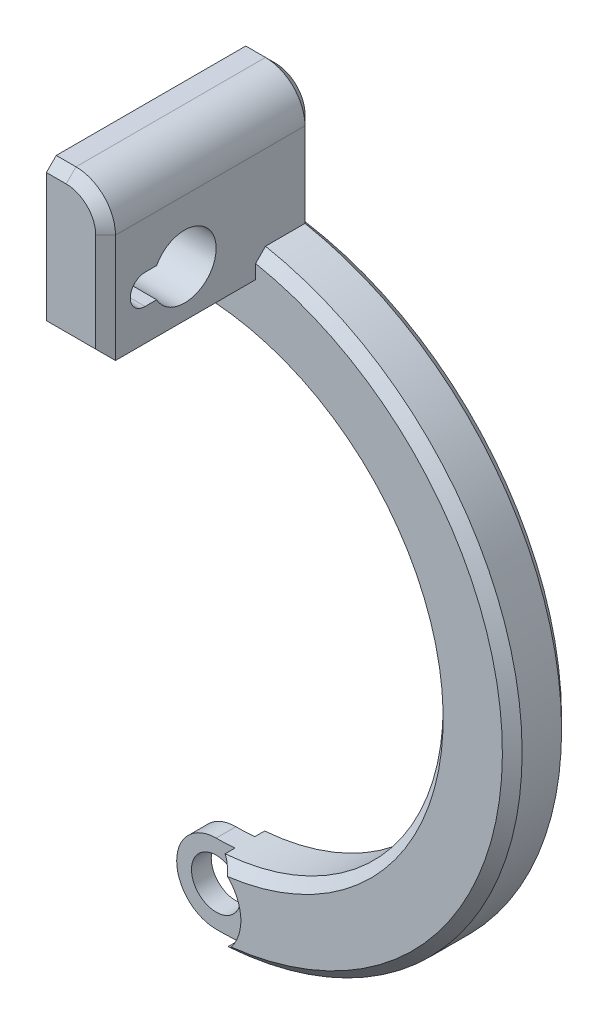
ISO-10303-21;
HEADER;
FILE_DESCRIPTION(('STEP AP214'),'2;1');
FILE_NAME('part.step','',(''),(''),'','','');
FILE_SCHEMA(('AUTOMOTIVE_DESIGN { 1 0 10303 214 1 1 1 1 }'));
ENDSEC;
DATA;
#1=APPLICATION_CONTEXT('core data for automotive mechanical design processes');
#2=APPLICATION_PROTOCOL_DEFINITION('international standard','automotive_design',2000,#1);
#3=PRODUCT_CONTEXT('',#1,'mechanical');
#4=PRODUCT('Part','Part','',(#3));
#5=PRODUCT_RELATED_PRODUCT_CATEGORY('part','',(#4));
#6=PRODUCT_DEFINITION_FORMATION('','',#4);
#7=PRODUCT_DEFINITION_CONTEXT('part definition',#1,'design');
#8=PRODUCT_DEFINITION('design','',#6,#7);
#9=PRODUCT_DEFINITION_SHAPE('','',#8);
#10=(LENGTH_UNIT() NAMED_UNIT(*) SI_UNIT(.MILLI.,.METRE.));
#11=(NAMED_UNIT(*) PLANE_ANGLE_UNIT() SI_UNIT($,.RADIAN.));
#12=(NAMED_UNIT(*) SI_UNIT($,.STERADIAN.) SOLID_ANGLE_UNIT());
#13=UNCERTAINTY_MEASURE_WITH_UNIT(LENGTH_MEASURE(1.E-05),#10,'distance_accuracy_value','');
#14=(GEOMETRIC_REPRESENTATION_CONTEXT(3) GLOBAL_UNCERTAINTY_ASSIGNED_CONTEXT((#13)) GLOBAL_UNIT_ASSIGNED_CONTEXT((#10,
#11,#12)) REPRESENTATION_CONTEXT('',''));
#15=CARTESIAN_POINT('',(0.,0.,0.));
#16=DIRECTION('',(0.,0.,1.));
#17=DIRECTION('',(1.,0.,0.));
#18=AXIS2_PLACEMENT_3D('',#15,#16,#17);
#19=CARTESIAN_POINT('',(0.,-32.,3.));
#20=DIRECTION('',(0.,0.,-1.));
#21=DIRECTION('',(-1.,0.,0.));
#22=AXIS2_PLACEMENT_3D('',#19,#20,#21);
#23=PLANE('',#22);
#24=CARTESIAN_POINT('',(0.,-60.,3.));
#25=DIRECTION('',(0.,0.,1.));
#26=DIRECTION('',(1.,0.,0.));
#27=AXIS2_PLACEMENT_3D('',#24,#25,#26);
#28=CIRCLE('',#27,4.5);
#29=CARTESIAN_POINT('',(3.52349247236404,-62.7991071428572,3.));
#30=VERTEX_POINT('',#29);
#31=CARTESIAN_POINT('',(3.16295509248738,-56.7991071428572,3.));
#32=VERTEX_POINT('',#31);
#33=EDGE_CURVE('E271',#30,#32,#28,.T.);
#34=ORIENTED_EDGE('',*,*,#33,.F.);
#35=CARTESIAN_POINT('',(0.,-32.,3.));
#36=DIRECTION('',(0.,0.,-1.));
#37=DIRECTION('',(-1.,0.,0.));
#38=AXIS2_PLACEMENT_3D('',#35,#36,#37);
#39=CIRCLE('',#38,31.);
#40=CARTESIAN_POINT('',(6.,-1.58618734850891,3.));
#41=VERTEX_POINT('',#40);
#42=EDGE_CURVE('E432',#30,#41,#39,.F.);
#43=ORIENTED_EDGE('',*,*,#42,.T.);
#44=DIRECTION('',(0.,1.,0.));
#45=VECTOR('',#44,1.);
#46=CARTESIAN_POINT('',(6.,-3.,3.));
#47=LINE('',#46,#45);
#48=CARTESIAN_POINT('',(6.,-3.,3.));
#49=VERTEX_POINT('',#48);
#50=EDGE_CURVE('E233',#49,#41,#47,.T.);
#51=ORIENTED_EDGE('',*,*,#50,.F.);
#52=DIRECTION('',(1.,0.,0.));
#53=VECTOR('',#52,1.);
#54=CARTESIAN_POINT('',(0.,-3.,3.));
#55=LINE('',#54,#53);
#56=CARTESIAN_POINT('',(0.,-3.,3.));
#57=VERTEX_POINT('',#56);
#58=EDGE_CURVE('E230',#57,#49,#55,.T.);
#59=ORIENTED_EDGE('',*,*,#58,.F.);
#60=DIRECTION('',(0.,-1.,0.));
#61=VECTOR('',#60,1.);
#62=CARTESIAN_POINT('',(0.,-8.00000000000001,3.));
#63=LINE('',#62,#61);
#64=CARTESIAN_POINT('',(0.,-7.,3.));
#65=VERTEX_POINT('',#64);
#66=EDGE_CURVE('E288',#57,#65,#63,.T.);
#67=ORIENTED_EDGE('',*,*,#66,.T.);
#68=CARTESIAN_POINT('',(0.,-32.,3.));
#69=DIRECTION('',(0.,0.,-1.));
#70=DIRECTION('',(-1.,0.,0.));
#71=AXIS2_PLACEMENT_3D('',#68,#69,#70);
#72=CIRCLE('',#71,25.);
#73=EDGE_CURVE('E317',#65,#32,#72,.T.);
#74=ORIENTED_EDGE('',*,*,#73,.T.);
#75=EDGE_LOOP('',(#34,#43,#51,#59,#67,#74));
#76=FACE_BOUND('',#75,.T.);
#77=ADVANCED_FACE('F34',(#76),#23,.F.);
#78=CARTESIAN_POINT('',(0.,-60.,3.));
#79=DIRECTION('',(0.,0.,-1.));
#80=DIRECTION('',(-1.,0.,0.));
#81=AXIS2_PLACEMENT_3D('',#78,#79,#80);
#82=CYLINDRICAL_SURFACE('',#81,4.);
#83=CARTESIAN_POINT('',(0.,-60.,-1.));
#84=DIRECTION('',(0.,0.,-1.));
#85=DIRECTION('',(-1.,0.,0.));
#86=AXIS2_PLACEMENT_3D('',#83,#84,#85);
#87=CIRCLE('',#86,4.);
#88=CARTESIAN_POINT('',(0.,-64.,-1.));
#89=VERTEX_POINT('',#88);
#90=CARTESIAN_POINT('',(0.,-56.,-1.));
#91=VERTEX_POINT('',#90);
#92=EDGE_CURVE('E260',#89,#91,#87,.T.);
#93=ORIENTED_EDGE('',*,*,#92,.F.);
#94=DIRECTION('',(0.,0.,-1.));
#95=VECTOR('',#94,1.);
#96=CARTESIAN_POINT('',(0.,-64.,3.));
#97=LINE('',#96,#95);
#98=CARTESIAN_POINT('',(0.,-64.,1.));
#99=VERTEX_POINT('',#98);
#100=EDGE_CURVE('E295',#99,#89,#97,.T.);
#101=ORIENTED_EDGE('',*,*,#100,.F.);
#102=CARTESIAN_POINT('',(0.,-60.,1.));
#103=DIRECTION('',(0.,0.,1.));
#104=DIRECTION('',(1.,0.,0.));
#105=AXIS2_PLACEMENT_3D('',#102,#103,#104);
#106=CIRCLE('',#105,4.);
#107=CARTESIAN_POINT('',(0.,-56.,1.));
#108=VERTEX_POINT('',#107);
#109=EDGE_CURVE('E280',#108,#99,#106,.T.);
#110=ORIENTED_EDGE('',*,*,#109,.F.);
#111=DIRECTION('',(0.,0.,-1.));
#112=VECTOR('',#111,1.);
#113=CARTESIAN_POINT('',(0.,-56.,3.));
#114=LINE('',#113,#112);
#115=EDGE_CURVE('E298',#108,#91,#114,.T.);
#116=ORIENTED_EDGE('',*,*,#115,.T.);
#117=EDGE_LOOP('',(#93,#101,#110,#116));
#118=FACE_BOUND('',#117,.T.);
#119=ADVANCED_FACE('F523',(#118),#82,.T.);
#120=CARTESIAN_POINT('',(0.,-60.,3.));
#121=DIRECTION('',(0.,0.,-1.));
#122=DIRECTION('',(-1.,0.,0.));
#123=AXIS2_PLACEMENT_3D('',#120,#121,#122);
#124=CYLINDRICAL_SURFACE('',#123,2.5);
#125=CARTESIAN_POINT('',(0.,-60.,1.));
#126=DIRECTION('',(0.,0.,1.));
#127=DIRECTION('',(1.,0.,0.));
#128=AXIS2_PLACEMENT_3D('',#125,#126,#127);
#129=CIRCLE('',#128,2.5);
#130=CARTESIAN_POINT('',(2.5,-60.,1.));
#131=VERTEX_POINT('',#130);
#132=EDGE_CURVE('E275',#131,#131,#129,.T.);
#133=ORIENTED_EDGE('',*,*,#132,.T.);
#134=EDGE_LOOP('',(#133));
#135=FACE_BOUND('',#134,.T.);
#136=CARTESIAN_POINT('',(0.,-60.,-1.));
#137=DIRECTION('',(0.,0.,-1.));
#138=DIRECTION('',(-1.,0.,0.));
#139=AXIS2_PLACEMENT_3D('',#136,#137,#138);
#140=CIRCLE('',#139,2.5);
#141=CARTESIAN_POINT('',(-2.5,-60.,-1.));
#142=VERTEX_POINT('',#141);
#143=EDGE_CURVE('E265',#142,#142,#140,.T.);
#144=ORIENTED_EDGE('',*,*,#143,.T.);
#145=EDGE_LOOP('',(#144));
#146=FACE_BOUND('',#145,.T.);
#147=ADVANCED_FACE('F343',(#135,#146),#124,.F.);
#148=CARTESIAN_POINT('',(0.,-32.,3.));
#149=DIRECTION('',(0.,0.,-1.));
#150=DIRECTION('',(-1.,0.,0.));
#151=AXIS2_PLACEMENT_3D('',#148,#149,#150);
#152=CYLINDRICAL_SURFACE('',#151,24.);
#153=DIRECTION('',(0.,0.,1.));
#154=VECTOR('',#153,1.);
#155=CARTESIAN_POINT('',(1.90711756771623,-55.9241071428571,2.));
#156=LINE('',#155,#154);
#157=CARTESIAN_POINT('',(1.90711756771621,-55.9241071428571,1.));
#158=VERTEX_POINT('',#157);
#159=CARTESIAN_POINT('',(1.90711756771623,-55.9241071428571,2.));
#160=VERTEX_POINT('',#159);
#161=EDGE_CURVE('E284',#158,#160,#156,.T.);
#162=ORIENTED_EDGE('',*,*,#161,.T.);
#163=CARTESIAN_POINT('',(0.,-32.,2.));
#164=DIRECTION('',(0.,0.,-1.));
#165=DIRECTION('',(-1.,0.,0.));
#166=AXIS2_PLACEMENT_3D('',#163,#164,#165);
#167=CIRCLE('',#166,24.);
#168=CARTESIAN_POINT('',(0.,-8.00000000000001,2.));
#169=VERTEX_POINT('',#168);
#170=EDGE_CURVE('E546',#160,#169,#167,.F.);
#171=ORIENTED_EDGE('',*,*,#170,.T.);
#172=DIRECTION('',(0.,0.,-1.));
#173=VECTOR('',#172,1.);
#174=CARTESIAN_POINT('',(0.,-8.00000000000001,3.));
#175=LINE('',#174,#173);
#176=CARTESIAN_POINT('',(0.,-8.00000000000001,-2.00000000000001));
#177=VERTEX_POINT('',#176);
#178=EDGE_CURVE('E291',#169,#177,#175,.T.);
#179=ORIENTED_EDGE('',*,*,#178,.T.);
#180=CARTESIAN_POINT('',(0.,-32.,-2.00000000000001));
#181=DIRECTION('',(0.,0.,-1.));
#182=DIRECTION('',(-1.,0.,0.));
#183=AXIS2_PLACEMENT_3D('',#180,#181,#182);
#184=CIRCLE('',#183,24.);
#185=CARTESIAN_POINT('',(1.90711756771623,-55.9241071428571,-2.00000000000001));
#186=VERTEX_POINT('',#185);
#187=EDGE_CURVE('E328',#177,#186,#184,.T.);
#188=ORIENTED_EDGE('',*,*,#187,.T.);
#189=DIRECTION('',(0.,0.,-1.));
#190=VECTOR('',#189,1.);
#191=CARTESIAN_POINT('',(1.90711756771623,-55.9241071428571,-2.));
#192=LINE('',#191,#190);
#193=CARTESIAN_POINT('',(1.90711756771621,-55.9241071428571,-1.));
#194=VERTEX_POINT('',#193);
#195=EDGE_CURVE('E268',#194,#186,#192,.T.);
#196=ORIENTED_EDGE('',*,*,#195,.F.);
#197=CARTESIAN_POINT('',(0.,-32.,-1.));
#198=DIRECTION('',(0.,0.,-1.));
#199=DIRECTION('',(-1.,0.,0.));
#200=AXIS2_PLACEMENT_3D('',#197,#198,#199);
#201=CIRCLE('',#200,24.);
#202=EDGE_CURVE('E263',#91,#194,#201,.F.);
#203=ORIENTED_EDGE('',*,*,#202,.F.);
#204=ORIENTED_EDGE('',*,*,#115,.F.);
#205=CARTESIAN_POINT('',(0.,-32.,1.));
#206=DIRECTION('',(0.,0.,1.));
#207=DIRECTION('',(1.,0.,0.));
#208=AXIS2_PLACEMENT_3D('',#205,#206,#207);
#209=CIRCLE('',#208,24.);
#210=EDGE_CURVE('E282',#158,#108,#209,.F.);
#211=ORIENTED_EDGE('',*,*,#210,.F.);
#212=EDGE_LOOP('',(#162,#171,#179,#188,#196,#203,#204,#211));
#213=FACE_BOUND('',#212,.T.);
#214=ADVANCED_FACE('F537',(#213),#152,.F.);
#215=CARTESIAN_POINT('',(0.,-32.,3.));
#216=DIRECTION('',(0.,0.,-1.));
#217=DIRECTION('',(-1.,0.,0.));
#218=AXIS2_PLACEMENT_3D('',#215,#216,#217);
#219=CYLINDRICAL_SURFACE('',#218,32.);
#220=DIRECTION('',(0.,0.,-1.));
#221=VECTOR('',#220,1.);
#222=CARTESIAN_POINT('',(6.,-0.567532708996581,16.9263375799849));
#223=LINE('',#222,#221);
#224=CARTESIAN_POINT('',(6.,-0.567532708996581,2.));
#225=VERTEX_POINT('',#224);
#226=CARTESIAN_POINT('',(6.,-0.567532708996581,-2.00000000000001));
#227=VERTEX_POINT('',#226);
#228=EDGE_CURVE('E248',#225,#227,#223,.T.);
#229=ORIENTED_EDGE('',*,*,#228,.F.);
#230=CARTESIAN_POINT('',(0.,-32.,2.));
#231=DIRECTION('',(0.,0.,-1.));
#232=DIRECTION('',(-1.,0.,0.));
#233=AXIS2_PLACEMENT_3D('',#230,#231,#232);
#234=CIRCLE('',#233,32.);
#235=CARTESIAN_POINT('',(2.20258555597215,-63.9241071428572,2.));
#236=VERTEX_POINT('',#235);
#237=EDGE_CURVE('E356',#225,#236,#234,.T.);
#238=ORIENTED_EDGE('',*,*,#237,.T.);
#239=DIRECTION('',(0.,0.,1.));
#240=VECTOR('',#239,1.);
#241=CARTESIAN_POINT('',(2.20258555597215,-63.9241071428572,2.));
#242=LINE('',#241,#240);
#243=CARTESIAN_POINT('',(2.20258555597222,-63.9241071428572,1.));
#244=VERTEX_POINT('',#243);
#245=EDGE_CURVE('E301',#236,#244,#242,.F.);
#246=ORIENTED_EDGE('',*,*,#245,.T.);
#247=CARTESIAN_POINT('',(0.,-32.,1.));
#248=DIRECTION('',(0.,0.,1.));
#249=DIRECTION('',(1.,0.,0.));
#250=AXIS2_PLACEMENT_3D('',#247,#248,#249);
#251=CIRCLE('',#250,32.);
#252=EDGE_CURVE('E277',#99,#244,#251,.T.);
#253=ORIENTED_EDGE('',*,*,#252,.F.);
#254=ORIENTED_EDGE('',*,*,#100,.T.);
#255=CARTESIAN_POINT('',(0.,-32.,-1.));
#256=DIRECTION('',(0.,0.,-1.));
#257=DIRECTION('',(-1.,0.,0.));
#258=AXIS2_PLACEMENT_3D('',#255,#256,#257);
#259=CIRCLE('',#258,32.);
#260=CARTESIAN_POINT('',(2.20258555597222,-63.9241071428572,-1.));
#261=VERTEX_POINT('',#260);
#262=EDGE_CURVE('E305',#261,#89,#259,.T.);
#263=ORIENTED_EDGE('',*,*,#262,.F.);
#264=DIRECTION('',(0.,0.,-1.));
#265=VECTOR('',#264,1.);
#266=CARTESIAN_POINT('',(2.20258555597215,-63.9241071428572,-2.));
#267=LINE('',#266,#265);
#268=CARTESIAN_POINT('',(2.20258555597215,-63.9241071428572,-2.00000000000001));
#269=VERTEX_POINT('',#268);
#270=EDGE_CURVE('E307',#269,#261,#267,.F.);
#271=ORIENTED_EDGE('',*,*,#270,.F.);
#272=CARTESIAN_POINT('',(0.,-32.,-2.00000000000001));
#273=DIRECTION('',(0.,0.,-1.));
#274=DIRECTION('',(-1.,0.,0.));
#275=AXIS2_PLACEMENT_3D('',#272,#273,#274);
#276=CIRCLE('',#275,32.);
#277=EDGE_CURVE('E434',#269,#227,#276,.F.);
#278=ORIENTED_EDGE('',*,*,#277,.T.);
#279=EDGE_LOOP('',(#229,#238,#246,#253,#254,#263,#271,#278));
#280=FACE_BOUND('',#279,.T.);
#281=ADVANCED_FACE('F441',(#280),#219,.T.);
#282=CARTESIAN_POINT('',(0.,-32.,-3.));
#283=DIRECTION('',(0.,0.,-1.));
#284=DIRECTION('',(-1.,0.,0.));
#285=AXIS2_PLACEMENT_3D('',#282,#283,#284);
#286=PLANE('',#285);
#287=DIRECTION('',(0.,-1.,0.));
#288=VECTOR('',#287,1.);
#289=CARTESIAN_POINT('',(0.,-8.00000000000001,-3.));
#290=LINE('',#289,#288);
#291=CARTESIAN_POINT('',(0.,11.,-3.));
#292=VERTEX_POINT('',#291);
#293=CARTESIAN_POINT('',(0.,-7.,-3.));
#294=VERTEX_POINT('',#293);
#295=EDGE_CURVE('E287',#292,#294,#290,.T.);
#296=ORIENTED_EDGE('',*,*,#295,.F.);
#297=DIRECTION('',(1.,0.,0.));
#298=VECTOR('',#297,1.);
#299=CARTESIAN_POINT('',(0.,11.,-3.));
#300=LINE('',#299,#298);
#301=CARTESIAN_POINT('',(2.,11.,-3.));
#302=VERTEX_POINT('',#301);
#303=EDGE_CURVE('E808',#292,#302,#300,.T.);
#304=ORIENTED_EDGE('',*,*,#303,.T.);
#305=CARTESIAN_POINT('',(2.,8.,-3.));
#306=DIRECTION('',(0.,0.,-1.));
#307=DIRECTION('',(-1.,0.,0.));
#308=AXIS2_PLACEMENT_3D('',#305,#306,#307);
#309=CIRCLE('',#308,3.);
#310=CARTESIAN_POINT('',(5.,8.,-3.));
#311=VERTEX_POINT('',#310);
#312=EDGE_CURVE('E834',#302,#311,#309,.T.);
#313=ORIENTED_EDGE('',*,*,#312,.T.);
#314=DIRECTION('',(0.,-1.,0.));
#315=VECTOR('',#314,1.);
#316=CARTESIAN_POINT('',(4.99999999999999,-32.,-3.));
#317=LINE('',#316,#315);
#318=CARTESIAN_POINT('',(5.,-1.40588291844329,-3.));
#319=VERTEX_POINT('',#318);
#320=EDGE_CURVE('E826',#311,#319,#317,.T.);
#321=ORIENTED_EDGE('',*,*,#320,.T.);
#322=CARTESIAN_POINT('',(0.,-32.,-3.));
#323=DIRECTION('',(0.,0.,-1.));
#324=DIRECTION('',(-1.,0.,0.));
#325=AXIS2_PLACEMENT_3D('',#322,#323,#324);
#326=CIRCLE('',#325,31.);
#327=CARTESIAN_POINT('',(3.52349247236405,-62.7991071428571,-3.));
#328=VERTEX_POINT('',#327);
#329=EDGE_CURVE('E355',#319,#328,#326,.T.);
#330=ORIENTED_EDGE('',*,*,#329,.T.);
#331=CARTESIAN_POINT('',(0.,-60.,-3.));
#332=DIRECTION('',(0.,0.,1.));
#333=DIRECTION('',(1.,0.,0.));
#334=AXIS2_PLACEMENT_3D('',#331,#332,#333);
#335=CIRCLE('',#334,4.5);
#336=CARTESIAN_POINT('',(3.16295509248738,-56.7991071428572,-3.));
#337=VERTEX_POINT('',#336);
#338=EDGE_CURVE('E251',#328,#337,#335,.T.);
#339=ORIENTED_EDGE('',*,*,#338,.T.);
#340=CARTESIAN_POINT('',(0.,-32.,-3.));
#341=DIRECTION('',(0.,0.,-1.));
#342=DIRECTION('',(-1.,0.,0.));
#343=AXIS2_PLACEMENT_3D('',#340,#341,#342);
#344=CIRCLE('',#343,25.);
#345=EDGE_CURVE('E427',#337,#294,#344,.F.);
#346=ORIENTED_EDGE('',*,*,#345,.T.);
#347=EDGE_LOOP('',(#296,#304,#313,#321,#330,#339,#346));
#348=FACE_BOUND('',#347,.T.);
#349=ADVANCED_FACE('F530',(#348),#286,.T.);
#350=CARTESIAN_POINT('',(0.,-8.00000000000001,3.));
#351=DIRECTION('',(1.,0.,0.));
#352=DIRECTION('',(0.,1.,0.));
#353=AXIS2_PLACEMENT_3D('',#350,#351,#352);
#354=PLANE('',#353);
#355=DIRECTION('',(0.,0.,1.));
#356=VECTOR('',#355,1.);
#357=CARTESIAN_POINT('',(0.,0.249999999999997,3.));
#358=LINE('',#357,#356);
#359=CARTESIAN_POINT('',(0.,0.25,13.0266588050205));
#360=VERTEX_POINT('',#359);
#361=CARTESIAN_POINT('',(0.,0.25,14.2));
#362=VERTEX_POINT('',#361);
#363=EDGE_CURVE('E229',#360,#362,#358,.T.);
#364=ORIENTED_EDGE('',*,*,#363,.F.);
#365=CARTESIAN_POINT('',(0.,1.75,10.2));
#366=DIRECTION('',(1.,0.,0.));
#367=DIRECTION('',(0.,1.,0.));
#368=AXIS2_PLACEMENT_3D('',#365,#366,#367);
#369=CIRCLE('',#368,3.2);
#370=CARTESIAN_POINT('',(0.,3.25,13.0266588050205));
#371=VERTEX_POINT('',#370);
#372=EDGE_CURVE('E219',#360,#371,#369,.T.);
#373=ORIENTED_EDGE('',*,*,#372,.T.);
#374=DIRECTION('',(0.,0.,1.));
#375=VECTOR('',#374,1.);
#376=CARTESIAN_POINT('',(0.,3.25,3.));
#377=LINE('',#376,#375);
#378=CARTESIAN_POINT('',(0.,3.25,14.2));
#379=VERTEX_POINT('',#378);
#380=EDGE_CURVE('E202',#371,#379,#377,.T.);
#381=ORIENTED_EDGE('',*,*,#380,.T.);
#382=CARTESIAN_POINT('',(0.,1.75,14.2));
#383=DIRECTION('',(1.,0.,0.));
#384=DIRECTION('',(0.,1.,0.));
#385=AXIS2_PLACEMENT_3D('',#382,#383,#384);
#386=CIRCLE('',#385,1.5);
#387=EDGE_CURVE('E213',#379,#362,#386,.T.);
#388=ORIENTED_EDGE('',*,*,#387,.T.);
#389=EDGE_LOOP('',(#364,#373,#381,#388));
#390=FACE_BOUND('',#389,.T.);
#391=DIRECTION('',(0.,-1.,0.));
#392=VECTOR('',#391,1.);
#393=CARTESIAN_POINT('',(0.,12.,18.2));
#394=LINE('',#393,#392);
#395=CARTESIAN_POINT('',(0.,11.,18.2));
#396=VERTEX_POINT('',#395);
#397=CARTESIAN_POINT('',(0.,-2.00000000000001,18.2));
#398=VERTEX_POINT('',#397);
#399=EDGE_CURVE('E238',#396,#398,#394,.T.);
#400=ORIENTED_EDGE('',*,*,#399,.F.);
#401=DIRECTION('',(0.,-0.707106781186548,0.707106781186548));
#402=VECTOR('',#401,1.);
#403=CARTESIAN_POINT('',(0.,11.,18.2));
#404=LINE('',#403,#402);
#405=CARTESIAN_POINT('',(0.,12.,17.2));
#406=VERTEX_POINT('',#405);
#407=EDGE_CURVE('E476',#396,#406,#404,.F.);
#408=ORIENTED_EDGE('',*,*,#407,.T.);
#409=DIRECTION('',(0.,0.,-1.));
#410=VECTOR('',#409,1.);
#411=CARTESIAN_POINT('',(0.,12.,16.9263375799849));
#412=LINE('',#411,#410);
#413=CARTESIAN_POINT('',(0.,12.,-2.00000000000001));
#414=VERTEX_POINT('',#413);
#415=EDGE_CURVE('E247',#406,#414,#412,.T.);
#416=ORIENTED_EDGE('',*,*,#415,.T.);
#417=DIRECTION('',(0.,0.707106781186553,0.707106781186542));
#418=VECTOR('',#417,1.);
#419=CARTESIAN_POINT('',(0.,11.,-3.));
#420=LINE('',#419,#418);
#421=EDGE_CURVE('E803',#414,#292,#420,.F.);
#422=ORIENTED_EDGE('',*,*,#421,.T.);
#423=ORIENTED_EDGE('',*,*,#295,.T.);
#424=DIRECTION('',(0.,-0.707106781186554,0.707106781186541));
#425=VECTOR('',#424,1.);
#426=CARTESIAN_POINT('',(0.,-32.,21.9999999999996));
#427=LINE('',#426,#425);
#428=EDGE_CURVE('E553',#294,#177,#427,.T.);
#429=ORIENTED_EDGE('',*,*,#428,.T.);
#430=ORIENTED_EDGE('',*,*,#178,.F.);
#431=DIRECTION('',(0.,0.707106781186549,0.707106781186546));
#432=VECTOR('',#431,1.);
#433=CARTESIAN_POINT('',(0.,-32.,-21.9999999999999));
#434=LINE('',#433,#432);
#435=EDGE_CURVE('E428',#169,#65,#434,.T.);
#436=ORIENTED_EDGE('',*,*,#435,.T.);
#437=ORIENTED_EDGE('',*,*,#66,.F.);
#438=DIRECTION('',(0.,0.,-1.));
#439=VECTOR('',#438,1.);
#440=CARTESIAN_POINT('',(0.,-3.,18.2));
#441=LINE('',#440,#439);
#442=CARTESIAN_POINT('',(0.,-3.,17.2));
#443=VERTEX_POINT('',#442);
#444=EDGE_CURVE('E245',#443,#57,#441,.T.);
#445=ORIENTED_EDGE('',*,*,#444,.F.);
#446=DIRECTION('',(0.,0.707106781186548,0.707106781186548));
#447=VECTOR('',#446,1.);
#448=CARTESIAN_POINT('',(0.,-2.00000000000001,18.2));
#449=LINE('',#448,#447);
#450=EDGE_CURVE('E459',#443,#398,#449,.T.);
#451=ORIENTED_EDGE('',*,*,#450,.T.);
#452=EDGE_LOOP('',(#400,#408,#416,#422,#423,#429,#430,#436,#437,#445,#451));
#453=FACE_BOUND('',#452,.T.);
#454=ADVANCED_FACE('F227',(#390,#453),#354,.F.);
#455=CARTESIAN_POINT('',(0.,-60.,1.));
#456=DIRECTION('',(0.,0.,1.));
#457=DIRECTION('',(1.,0.,0.));
#458=AXIS2_PLACEMENT_3D('',#455,#456,#457);
#459=CYLINDRICAL_SURFACE('',#458,4.5);
#460=ORIENTED_EDGE('',*,*,#245,.F.);
#461=CARTESIAN_POINT('',(2.20258555597215,-63.9241071428572,2.));
#462=CARTESIAN_POINT('',(2.33802761899803,-63.8480924100437,2.06650982001766));
#463=CARTESIAN_POINT('',(2.4673742077961,-63.7662671043739,2.13831701035711));
#464=CARTESIAN_POINT('',(2.71241768825517,-63.5937436739057,2.29029627540576));
#465=CARTESIAN_POINT('',(2.82823510634939,-63.5031395911443,2.37038019623337));
#466=CARTESIAN_POINT('',(3.04735906531457,-63.3142934382755,2.53799992208815));
#467=CARTESIAN_POINT('',(3.1506708469213,-63.2160545962052,2.62553257920085));
#468=CARTESIAN_POINT('',(3.34596006563453,-63.0124113609103,2.80779746406612));
#469=CARTESIAN_POINT('',(3.43781625989798,-62.9069460844022,2.90259194117586));
#470=CARTESIAN_POINT('',(3.52349247236404,-62.7991071428572,2.99999999999999));
#471=B_SPLINE_CURVE_WITH_KNOTS('',3,(#461,#462,#463,#464,#465,#466,#467,#468,#469,#470),
.UNSPECIFIED.,.F.,.F.,(4,2,2,2,4),(0.,0.506311967859587,1.00769931680795,1.508875816593,
2.01497300614704),.UNSPECIFIED.);
#472=EDGE_CURVE('E347',#236,#30,#471,.T.);
#473=ORIENTED_EDGE('',*,*,#472,.T.);
#474=ORIENTED_EDGE('',*,*,#33,.T.);
#475=CARTESIAN_POINT('',(3.16295509248739,-56.7991071428571,3.));
#476=CARTESIAN_POINT('',(3.07705470656649,-56.7142569101401,2.90497511409763));
#477=CARTESIAN_POINT('',(2.98658296225638,-56.6316606723324,2.8119178076655));
#478=CARTESIAN_POINT('',(2.79685902479805,-56.4725580956041,2.63171174985887));
#479=CARTESIAN_POINT('',(2.69767980899535,-56.396009759784,2.54452301829783));
#480=CARTESIAN_POINT('',(2.48954523342711,-56.2492165273624,2.3764882563442));
#481=CARTESIAN_POINT('',(2.38058558657629,-56.178974422239,2.29564503678894));
#482=CARTESIAN_POINT('',(2.15187880733229,-56.0456306050374,2.14148705099008));
#483=CARTESIAN_POINT('',(2.03205447377518,-55.9825885788819,2.06823562352342));
#484=CARTESIAN_POINT('',(1.90711756771636,-55.9241071428571,1.99999999999992));
#485=B_SPLINE_CURVE_WITH_KNOTS('',3,(#475,#476,#477,#478,#479,#480,#481,#482,#483,#484),
.UNSPECIFIED.,.F.,.F.,(4,2,2,2,4),(0.,0.460985617646466,0.918421472959779,1.37605882587027,
1.83725003900482),.UNSPECIFIED.);
#486=EDGE_CURVE('E320',#32,#160,#485,.T.);
#487=ORIENTED_EDGE('',*,*,#486,.T.);
#488=ORIENTED_EDGE('',*,*,#161,.F.);
#489=CARTESIAN_POINT('',(0.,-60.,1.));
#490=DIRECTION('',(0.,0.,1.));
#491=DIRECTION('',(1.,0.,0.));
#492=AXIS2_PLACEMENT_3D('',#489,#490,#491);
#493=CIRCLE('',#492,4.5);
#494=EDGE_CURVE('E272',#244,#158,#493,.T.);
#495=ORIENTED_EDGE('',*,*,#494,.F.);
#496=EDGE_LOOP('',(#460,#473,#474,#487,#488,#495));
#497=FACE_BOUND('',#496,.T.);
#498=ADVANCED_FACE('F335',(#497),#459,.F.);
#499=CARTESIAN_POINT('',(0.,-60.,1.));
#500=DIRECTION('',(0.,0.,1.));
#501=DIRECTION('',(1.,0.,0.));
#502=AXIS2_PLACEMENT_3D('',#499,#500,#501);
#503=PLANE('',#502);
#504=ORIENTED_EDGE('',*,*,#132,.F.);
#505=EDGE_LOOP('',(#504));
#506=FACE_BOUND('',#505,.T.);
#507=ORIENTED_EDGE('',*,*,#210,.T.);
#508=ORIENTED_EDGE('',*,*,#109,.T.);
#509=ORIENTED_EDGE('',*,*,#252,.T.);
#510=ORIENTED_EDGE('',*,*,#494,.T.);
#511=EDGE_LOOP('',(#507,#508,#509,#510));
#512=FACE_BOUND('',#511,.T.);
#513=ADVANCED_FACE('F340',(#506,#512),#503,.T.);
#514=CARTESIAN_POINT('',(0.,-60.,-1.));
#515=DIRECTION('',(0.,0.,-1.));
#516=DIRECTION('',(-1.,0.,0.));
#517=AXIS2_PLACEMENT_3D('',#514,#515,#516);
#518=CYLINDRICAL_SURFACE('',#517,4.5);
#519=ORIENTED_EDGE('',*,*,#338,.F.);
#520=CARTESIAN_POINT('',(3.52349247236405,-62.7991071428571,-3.));
#521=CARTESIAN_POINT('',(3.43781625989799,-62.9069460844022,-2.90259194117588));
#522=CARTESIAN_POINT('',(3.34596006563454,-63.0124113609103,-2.80779746406614));
#523=CARTESIAN_POINT('',(3.15067084692131,-63.2160545962052,-2.62553257920087));
#524=CARTESIAN_POINT('',(3.04735906531459,-63.3142934382755,-2.53799992208817));
#525=CARTESIAN_POINT('',(2.82823510634941,-63.5031395911443,-2.37038019623339));
#526=CARTESIAN_POINT('',(2.71241768825518,-63.5937436739057,-2.29029627540578));
#527=CARTESIAN_POINT('',(2.46737420779613,-63.7662671043739,-2.13831701035713));
#528=CARTESIAN_POINT('',(2.33802761899807,-63.8480924100438,-2.06650982001767));
#529=CARTESIAN_POINT('',(2.20258555597222,-63.9241071428572,-1.99999999999999));
#530=B_SPLINE_CURVE_WITH_KNOTS('',3,(#520,#521,#522,#523,#524,#525,#526,#527,#528,#529),
.UNSPECIFIED.,.F.,.F.,(4,2,2,2,4),(0.,0.506097189554036,1.00727368933908,1.50866103828744,
2.01497300614702),.UNSPECIFIED.);
#531=EDGE_CURVE('E386',#328,#269,#530,.T.);
#532=ORIENTED_EDGE('',*,*,#531,.T.);
#533=ORIENTED_EDGE('',*,*,#270,.T.);
#534=CARTESIAN_POINT('',(0.,-60.,-1.));
#535=DIRECTION('',(0.,0.,1.));
#536=DIRECTION('',(1.,0.,0.));
#537=AXIS2_PLACEMENT_3D('',#534,#535,#536);
#538=CIRCLE('',#537,4.5);
#539=EDGE_CURVE('E257',#261,#194,#538,.T.);
#540=ORIENTED_EDGE('',*,*,#539,.T.);
#541=ORIENTED_EDGE('',*,*,#195,.T.);
#542=CARTESIAN_POINT('',(1.90711756771623,-55.9241071428571,-2.00000000000001));
#543=CARTESIAN_POINT('',(2.03205447377512,-55.9825885788819,-2.06823562352345));
#544=CARTESIAN_POINT('',(2.15187880733225,-56.0456306050374,-2.14148705099009));
#545=CARTESIAN_POINT('',(2.38058558657628,-56.178974422239,-2.29564503678893));
#546=CARTESIAN_POINT('',(2.4895452334271,-56.2492165273624,-2.37648825634419));
#547=CARTESIAN_POINT('',(2.69767980899533,-56.396009759784,-2.54452301829783));
#548=CARTESIAN_POINT('',(2.79685902479803,-56.4725580956041,-2.63171174985887));
#549=CARTESIAN_POINT('',(2.98658296225637,-56.6316606723324,-2.81191780766549));
#550=CARTESIAN_POINT('',(3.07705470656649,-56.7142569101401,-2.90497511409763));
#551=CARTESIAN_POINT('',(3.16295509248738,-56.7991071428571,-3.));
#552=B_SPLINE_CURVE_WITH_KNOTS('',3,(#542,#543,#544,#545,#546,#547,#548,#549,#550,#551),
.UNSPECIFIED.,.F.,.F.,(4,2,2,2,4),(0.,0.461191213134563,0.918828566045062,1.37626442135837,
1.83725003900485),.UNSPECIFIED.);
#553=EDGE_CURVE('E419',#186,#337,#552,.T.);
#554=ORIENTED_EDGE('',*,*,#553,.T.);
#555=EDGE_LOOP('',(#519,#532,#533,#540,#541,#554));
#556=FACE_BOUND('',#555,.T.);
#557=ADVANCED_FACE('F412',(#556),#518,.F.);
#558=CARTESIAN_POINT('',(0.,-60.,-1.));
#559=DIRECTION('',(0.,0.,-1.));
#560=DIRECTION('',(1.,0.,0.));
#561=AXIS2_PLACEMENT_3D('',#558,#559,#560);
#562=PLANE('',#561);
#563=ORIENTED_EDGE('',*,*,#143,.F.);
#564=EDGE_LOOP('',(#563));
#565=FACE_BOUND('',#564,.T.);
#566=ORIENTED_EDGE('',*,*,#202,.T.);
#567=ORIENTED_EDGE('',*,*,#539,.F.);
#568=ORIENTED_EDGE('',*,*,#262,.T.);
#569=ORIENTED_EDGE('',*,*,#92,.T.);
#570=EDGE_LOOP('',(#566,#567,#568,#569));
#571=FACE_BOUND('',#570,.T.);
#572=ADVANCED_FACE('F401',(#565,#571),#562,.T.);
#573=CARTESIAN_POINT('',(6.,8.,16.9263375799849));
#574=DIRECTION('',(1.,0.,0.));
#575=DIRECTION('',(0.,1.,0.));
#576=AXIS2_PLACEMENT_3D('',#573,#574,#575);
#577=PLANE('',#576);
#578=CARTESIAN_POINT('',(6.,1.75,10.2));
#579=DIRECTION('',(1.,0.,0.));
#580=DIRECTION('',(0.,1.,0.));
#581=AXIS2_PLACEMENT_3D('',#578,#579,#580);
#582=CIRCLE('',#581,3.2);
#583=CARTESIAN_POINT('',(5.99999999999999,0.25,13.0266588050205));
#584=VERTEX_POINT('',#583);
#585=CARTESIAN_POINT('',(6.,3.25,13.0266588050205));
#586=VERTEX_POINT('',#585);
#587=EDGE_CURVE('E222',#584,#586,#582,.T.);
#588=ORIENTED_EDGE('',*,*,#587,.F.);
#589=DIRECTION('',(0.,0.,1.));
#590=VECTOR('',#589,1.);
#591=CARTESIAN_POINT('',(6.,0.250000000000001,16.9263375799849));
#592=LINE('',#591,#590);
#593=CARTESIAN_POINT('',(6.,0.25,14.2));
#594=VERTEX_POINT('',#593);
#595=EDGE_CURVE('E313',#584,#594,#592,.T.);
#596=ORIENTED_EDGE('',*,*,#595,.T.);
#597=CARTESIAN_POINT('',(6.,1.75,14.2));
#598=DIRECTION('',(1.,0.,0.));
#599=DIRECTION('',(0.,1.,0.));
#600=AXIS2_PLACEMENT_3D('',#597,#598,#599);
#601=CIRCLE('',#600,1.5);
#602=CARTESIAN_POINT('',(6.,3.25,14.2));
#603=VERTEX_POINT('',#602);
#604=EDGE_CURVE('E311',#603,#594,#601,.T.);
#605=ORIENTED_EDGE('',*,*,#604,.F.);
#606=DIRECTION('',(0.,0.,1.));
#607=VECTOR('',#606,1.);
#608=CARTESIAN_POINT('',(6.,3.25,16.9263375799849));
#609=LINE('',#608,#607);
#610=EDGE_CURVE('E309',#586,#603,#609,.T.);
#611=ORIENTED_EDGE('',*,*,#610,.F.);
#612=EDGE_LOOP('',(#588,#596,#605,#611));
#613=FACE_BOUND('',#612,.T.);
#614=DIRECTION('',(0.,0.,-1.));
#615=VECTOR('',#614,1.);
#616=CARTESIAN_POINT('',(6.,8.,16.9263375799849));
#617=LINE('',#616,#615);
#618=CARTESIAN_POINT('',(6.,8.,17.2));
#619=VERTEX_POINT('',#618);
#620=CARTESIAN_POINT('',(6.,8.,-2.00000000000001));
#621=VERTEX_POINT('',#620);
#622=EDGE_CURVE('E252',#619,#621,#617,.T.);
#623=ORIENTED_EDGE('',*,*,#622,.F.);
#624=DIRECTION('',(0.,-1.,0.));
#625=VECTOR('',#624,1.);
#626=CARTESIAN_POINT('',(6.,8.,17.2));
#627=LINE('',#626,#625);
#628=CARTESIAN_POINT('',(6.,-3.,17.2));
#629=VERTEX_POINT('',#628);
#630=EDGE_CURVE('E11',#619,#629,#627,.T.);
#631=ORIENTED_EDGE('',*,*,#630,.T.);
#632=DIRECTION('',(0.,0.,-1.));
#633=VECTOR('',#632,1.);
#634=CARTESIAN_POINT('',(6.,-3.,18.2));
#635=LINE('',#634,#633);
#636=EDGE_CURVE('E240',#629,#49,#635,.T.);
#637=ORIENTED_EDGE('',*,*,#636,.T.);
#638=ORIENTED_EDGE('',*,*,#50,.T.);
#639=CARTESIAN_POINT('',(6.,-1.58618734850891,3.));
#640=CARTESIAN_POINT('',(6.,-1.41636177249157,2.83338406503091));
#641=CARTESIAN_POINT('',(6.,-1.24656109782681,2.66674276418349));
#642=CARTESIAN_POINT('',(6.,-0.907009551322737,2.33340943085013));
#643=CARTESIAN_POINT('',(6.,-0.73725867948339,2.16671739836421));
#644=CARTESIAN_POINT('',(6.,-0.567532708996578,2.));
#645=B_SPLINE_CURVE_WITH_KNOTS('',3,(#639,#640,#641,#642,#643,#644),.UNSPECIFIED.,.F.,.F.,(4,2,
4),(0.,0.713732674313392,1.42746534812099),.UNSPECIFIED.);
#646=EDGE_CURVE('E377',#41,#225,#645,.T.);
#647=ORIENTED_EDGE('',*,*,#646,.T.);
#648=ORIENTED_EDGE('',*,*,#228,.T.);
#649=DIRECTION('',(0.,1.,0.));
#650=VECTOR('',#649,1.);
#651=CARTESIAN_POINT('',(6.,8.,-2.00000000000001));
#652=LINE('',#651,#650);
#653=EDGE_CURVE('E813',#227,#621,#652,.T.);
#654=ORIENTED_EDGE('',*,*,#653,.T.);
#655=EDGE_LOOP('',(#623,#631,#637,#638,#647,#648,#654));
#656=FACE_BOUND('',#655,.T.);
#657=ADVANCED_FACE('F395',(#613,#656),#577,.T.);
#658=CARTESIAN_POINT('',(2.,8.,16.9263375799849));
#659=DIRECTION('',(0.,0.,-1.));
#660=DIRECTION('',(-1.,0.,0.));
#661=AXIS2_PLACEMENT_3D('',#658,#659,#660);
#662=CYLINDRICAL_SURFACE('',#661,4.);
#663=DIRECTION('',(0.,0.,-1.));
#664=VECTOR('',#663,1.);
#665=CARTESIAN_POINT('',(2.,12.,16.9263375799849));
#666=LINE('',#665,#664);
#667=CARTESIAN_POINT('',(2.,12.,17.2));
#668=VERTEX_POINT('',#667);
#669=CARTESIAN_POINT('',(2.,12.,-2.00000000000001));
#670=VERTEX_POINT('',#669);
#671=EDGE_CURVE('E254',#668,#670,#666,.T.);
#672=ORIENTED_EDGE('',*,*,#671,.F.);
#673=CARTESIAN_POINT('',(2.,8.,17.2));
#674=DIRECTION('',(0.,0.,1.));
#675=DIRECTION('',(1.,0.,0.));
#676=AXIS2_PLACEMENT_3D('',#673,#674,#675);
#677=CIRCLE('',#676,4.);
#678=EDGE_CURVE('E58',#668,#619,#677,.F.);
#679=ORIENTED_EDGE('',*,*,#678,.T.);
#680=ORIENTED_EDGE('',*,*,#622,.T.);
#681=CARTESIAN_POINT('',(2.,8.,-2.00000000000001));
#682=DIRECTION('',(0.,0.,-1.));
#683=DIRECTION('',(-1.,0.,0.));
#684=AXIS2_PLACEMENT_3D('',#681,#682,#683);
#685=CIRCLE('',#684,4.);
#686=EDGE_CURVE('E810',#621,#670,#685,.F.);
#687=ORIENTED_EDGE('',*,*,#686,.T.);
#688=EDGE_LOOP('',(#672,#679,#680,#687));
#689=FACE_BOUND('',#688,.T.);
#690=ADVANCED_FACE('F400',(#689),#662,.T.);
#691=CARTESIAN_POINT('',(0.,12.,16.9263375799849));
#692=DIRECTION('',(0.,1.,0.));
#693=DIRECTION('',(-1.,0.,0.));
#694=AXIS2_PLACEMENT_3D('',#691,#692,#693);
#695=PLANE('',#694);
#696=ORIENTED_EDGE('',*,*,#415,.F.);
#697=DIRECTION('',(1.,0.,0.));
#698=VECTOR('',#697,1.);
#699=CARTESIAN_POINT('',(0.,12.,17.2));
#700=LINE('',#699,#698);
#701=EDGE_CURVE('E474',#406,#668,#700,.T.);
#702=ORIENTED_EDGE('',*,*,#701,.T.);
#703=ORIENTED_EDGE('',*,*,#671,.T.);
#704=DIRECTION('',(-1.,0.,0.));
#705=VECTOR('',#704,1.);
#706=CARTESIAN_POINT('',(0.,12.,-2.00000000000001));
#707=LINE('',#706,#705);
#708=EDGE_CURVE('E805',#670,#414,#707,.T.);
#709=ORIENTED_EDGE('',*,*,#708,.T.);
#710=EDGE_LOOP('',(#696,#702,#703,#709));
#711=FACE_BOUND('',#710,.T.);
#712=ADVANCED_FACE('F407',(#711),#695,.T.);
#713=CARTESIAN_POINT('',(0.,-3.,18.2));
#714=DIRECTION('',(0.,1.,0.));
#715=DIRECTION('',(0.,0.,1.));
#716=AXIS2_PLACEMENT_3D('',#713,#714,#715);
#717=PLANE('',#716);
#718=ORIENTED_EDGE('',*,*,#636,.F.);
#719=DIRECTION('',(-1.,0.,0.));
#720=VECTOR('',#719,1.);
#721=CARTESIAN_POINT('',(0.,-3.,17.2));
#722=LINE('',#721,#720);
#723=EDGE_CURVE('E44',#629,#443,#722,.T.);
#724=ORIENTED_EDGE('',*,*,#723,.T.);
#725=ORIENTED_EDGE('',*,*,#444,.T.);
#726=ORIENTED_EDGE('',*,*,#58,.T.);
#727=EDGE_LOOP('',(#718,#724,#725,#726));
#728=FACE_BOUND('',#727,.T.);
#729=ADVANCED_FACE('F403',(#728),#717,.F.);
#730=CARTESIAN_POINT('',(2.,8.,18.2));
#731=DIRECTION('',(0.,0.,1.));
#732=DIRECTION('',(1.,0.,0.));
#733=AXIS2_PLACEMENT_3D('',#730,#731,#732);
#734=PLANE('',#733);
#735=CARTESIAN_POINT('',(2.,8.,18.2));
#736=DIRECTION('',(0.,0.,1.));
#737=DIRECTION('',(1.,0.,0.));
#738=AXIS2_PLACEMENT_3D('',#735,#736,#737);
#739=CIRCLE('',#738,3.00000000000001);
#740=CARTESIAN_POINT('',(5.00000000000001,8.,18.2));
#741=VERTEX_POINT('',#740);
#742=CARTESIAN_POINT('',(2.,11.,18.2));
#743=VERTEX_POINT('',#742);
#744=EDGE_CURVE('E482',#741,#743,#739,.T.);
#745=ORIENTED_EDGE('',*,*,#744,.T.);
#746=DIRECTION('',(-1.,0.,0.));
#747=VECTOR('',#746,1.);
#748=CARTESIAN_POINT('',(2.,11.,18.2));
#749=LINE('',#748,#747);
#750=EDGE_CURVE('E479',#743,#396,#749,.T.);
#751=ORIENTED_EDGE('',*,*,#750,.T.);
#752=ORIENTED_EDGE('',*,*,#399,.T.);
#753=DIRECTION('',(1.,0.,0.));
#754=VECTOR('',#753,1.);
#755=CARTESIAN_POINT('',(6.,-2.00000000000001,18.2));
#756=LINE('',#755,#754);
#757=CARTESIAN_POINT('',(5.,-2.00000000000001,18.2));
#758=VERTEX_POINT('',#757);
#759=EDGE_CURVE('E484',#398,#758,#756,.T.);
#760=ORIENTED_EDGE('',*,*,#759,.T.);
#761=DIRECTION('',(0.,1.,0.));
#762=VECTOR('',#761,1.);
#763=CARTESIAN_POINT('',(5.00000000000001,8.,18.2));
#764=LINE('',#763,#762);
#765=EDGE_CURVE('E385',#758,#741,#764,.T.);
#766=ORIENTED_EDGE('',*,*,#765,.T.);
#767=EDGE_LOOP('',(#745,#751,#752,#760,#766));
#768=FACE_BOUND('',#767,.T.);
#769=ADVANCED_FACE('F610',(#768),#734,.T.);
#770=CARTESIAN_POINT('',(-6.5,1.75,10.2));
#771=DIRECTION('',(1.,0.,0.));
#772=DIRECTION('',(0.,0.,-1.));
#773=AXIS2_PLACEMENT_3D('',#770,#771,#772);
#774=CYLINDRICAL_SURFACE('',#773,3.2);
#775=DIRECTION('',(1.,0.,0.));
#776=VECTOR('',#775,1.);
#777=CARTESIAN_POINT('',(-6.5,0.25,13.0266588050205));
#778=LINE('',#777,#776);
#779=EDGE_CURVE('E214',#360,#584,#778,.T.);
#780=ORIENTED_EDGE('',*,*,#779,.T.);
#781=ORIENTED_EDGE('',*,*,#587,.T.);
#782=DIRECTION('',(1.,0.,0.));
#783=VECTOR('',#782,1.);
#784=CARTESIAN_POINT('',(-6.5,3.25,13.0266588050205));
#785=LINE('',#784,#783);
#786=EDGE_CURVE('E205',#371,#586,#785,.T.);
#787=ORIENTED_EDGE('',*,*,#786,.F.);
#788=ORIENTED_EDGE('',*,*,#372,.F.);
#789=EDGE_LOOP('',(#780,#781,#787,#788));
#790=FACE_BOUND('',#789,.T.);
#791=ADVANCED_FACE('F218',(#790),#774,.F.);
#792=CARTESIAN_POINT('',(-6.5,0.249999999999995,0.));
#793=DIRECTION('',(0.,1.,0.));
#794=DIRECTION('',(0.,0.,1.));
#795=AXIS2_PLACEMENT_3D('',#792,#793,#794);
#796=PLANE('',#795);
#797=ORIENTED_EDGE('',*,*,#363,.T.);
#798=DIRECTION('',(1.,0.,0.));
#799=VECTOR('',#798,1.);
#800=CARTESIAN_POINT('',(-6.5,0.25,14.2));
#801=LINE('',#800,#799);
#802=EDGE_CURVE('E848',#362,#594,#801,.T.);
#803=ORIENTED_EDGE('',*,*,#802,.T.);
#804=ORIENTED_EDGE('',*,*,#595,.F.);
#805=ORIENTED_EDGE('',*,*,#779,.F.);
#806=EDGE_LOOP('',(#797,#803,#804,#805));
#807=FACE_BOUND('',#806,.T.);
#808=ADVANCED_FACE('F624',(#807),#796,.T.);
#809=CARTESIAN_POINT('',(-6.5,1.75,14.2));
#810=DIRECTION('',(1.,0.,0.));
#811=DIRECTION('',(0.,0.,-1.));
#812=AXIS2_PLACEMENT_3D('',#809,#810,#811);
#813=CYLINDRICAL_SURFACE('',#812,1.5);
#814=DIRECTION('',(1.,0.,0.));
#815=VECTOR('',#814,1.);
#816=CARTESIAN_POINT('',(-6.5,3.25,14.2));
#817=LINE('',#816,#815);
#818=EDGE_CURVE('E208',#379,#603,#817,.T.);
#819=ORIENTED_EDGE('',*,*,#818,.T.);
#820=ORIENTED_EDGE('',*,*,#604,.T.);
#821=ORIENTED_EDGE('',*,*,#802,.F.);
#822=ORIENTED_EDGE('',*,*,#387,.F.);
#823=EDGE_LOOP('',(#819,#820,#821,#822));
#824=FACE_BOUND('',#823,.T.);
#825=ADVANCED_FACE('F632',(#824),#813,.F.);
#826=CARTESIAN_POINT('',(-6.5,3.25000000000001,0.));
#827=DIRECTION('',(0.,1.,0.));
#828=DIRECTION('',(0.,0.,1.));
#829=AXIS2_PLACEMENT_3D('',#826,#827,#828);
#830=PLANE('',#829);
#831=ORIENTED_EDGE('',*,*,#786,.T.);
#832=ORIENTED_EDGE('',*,*,#610,.T.);
#833=ORIENTED_EDGE('',*,*,#818,.F.);
#834=ORIENTED_EDGE('',*,*,#380,.F.);
#835=EDGE_LOOP('',(#831,#832,#833,#834));
#836=FACE_BOUND('',#835,.T.);
#837=ADVANCED_FACE('F204',(#836),#830,.F.);
#838=CARTESIAN_POINT('',(0.,-32.,3.));
#839=DIRECTION('',(0.,0.,1.));
#840=DIRECTION('',(1.,0.,0.));
#841=AXIS2_PLACEMENT_3D('',#838,#839,#840);
#842=CONICAL_SURFACE('',#841,25.,0.78539816339745);
#843=ORIENTED_EDGE('',*,*,#435,.F.);
#844=ORIENTED_EDGE('',*,*,#170,.F.);
#845=ORIENTED_EDGE('',*,*,#486,.F.);
#846=ORIENTED_EDGE('',*,*,#73,.F.);
#847=EDGE_LOOP('',(#843,#844,#845,#846));
#848=FACE_BOUND('',#847,.T.);
#849=ADVANCED_FACE('F331',(#848),#842,.F.);
#850=CARTESIAN_POINT('',(0.,-32.,-2.00000000000001));
#851=DIRECTION('',(0.,0.,-1.));
#852=DIRECTION('',(-1.,0.,0.));
#853=AXIS2_PLACEMENT_3D('',#850,#851,#852);
#854=CONICAL_SURFACE('',#853,24.,0.785398163397457);
#855=ORIENTED_EDGE('',*,*,#428,.F.);
#856=ORIENTED_EDGE('',*,*,#345,.F.);
#857=ORIENTED_EDGE('',*,*,#553,.F.);
#858=ORIENTED_EDGE('',*,*,#187,.F.);
#859=EDGE_LOOP('',(#855,#856,#857,#858));
#860=FACE_BOUND('',#859,.T.);
#861=ADVANCED_FACE('F369',(#860),#854,.F.);
#862=CARTESIAN_POINT('',(0.,-32.,3.));
#863=DIRECTION('',(0.,0.,-1.));
#864=DIRECTION('',(-1.,0.,0.));
#865=AXIS2_PLACEMENT_3D('',#862,#863,#864);
#866=CONICAL_SURFACE('',#865,31.,0.78539816339745);
#867=ORIENTED_EDGE('',*,*,#472,.F.);
#868=ORIENTED_EDGE('',*,*,#237,.F.);
#869=ORIENTED_EDGE('',*,*,#646,.F.);
#870=ORIENTED_EDGE('',*,*,#42,.F.);
#871=EDGE_LOOP('',(#867,#868,#869,#870));
#872=FACE_BOUND('',#871,.T.);
#873=ADVANCED_FACE('F360',(#872),#866,.T.);
#874=CARTESIAN_POINT('',(0.,-32.,-2.00000000000001));
#875=DIRECTION('',(0.,0.,1.));
#876=DIRECTION('',(1.,0.,0.));
#877=AXIS2_PLACEMENT_3D('',#874,#875,#876);
#878=CONICAL_SURFACE('',#877,32.,0.785398163397455);
#879=ORIENTED_EDGE('',*,*,#531,.F.);
#880=ORIENTED_EDGE('',*,*,#329,.F.);
#881=CARTESIAN_POINT('',(5.,-1.40588291844329,-3.));
#882=CARTESIAN_POINT('',(5.16608093274852,-1.26476045956833,-2.83391906725148));
#883=CARTESIAN_POINT('',(5.33245474412147,-1.12433670302901,-2.66754525587853));
#884=CARTESIAN_POINT('',(5.66578807761823,-0.844886633603297,-2.33421192238178));
#885=CARTESIAN_POINT('',(5.8327475995786,-0.705860320327045,-2.16725240042141));
#886=CARTESIAN_POINT('',(6.,-0.567532708996577,-2.00000000000001));
#887=B_SPLINE_CURVE_WITH_KNOTS('',3,(#881,#882,#883,#884,#885,#886),.UNSPECIFIED.,.F.,.F.,(4,2,
4),(0.,0.822018183861693,1.64403613839003),.UNSPECIFIED.);
#888=EDGE_CURVE('E224',#227,#319,#887,.F.);
#889=ORIENTED_EDGE('',*,*,#888,.F.);
#890=ORIENTED_EDGE('',*,*,#277,.F.);
#891=EDGE_LOOP('',(#879,#880,#889,#890));
#892=FACE_BOUND('',#891,.T.);
#893=ADVANCED_FACE('F368',(#892),#878,.T.);
#894=CARTESIAN_POINT('',(4.99999999999999,-32.,-3.));
#895=DIRECTION('',(-0.707106781186543,0.,0.707106781186552));
#896=DIRECTION('',(0.,-1.,0.));
#897=AXIS2_PLACEMENT_3D('',#894,#895,#896);
#898=PLANE('',#897);
#899=ORIENTED_EDGE('',*,*,#888,.T.);
#900=ORIENTED_EDGE('',*,*,#320,.F.);
#901=DIRECTION('',(-0.707106781186552,0.,-0.707106781186543));
#902=VECTOR('',#901,1.);
#903=CARTESIAN_POINT('',(6.,8.,-2.00000000000001));
#904=LINE('',#903,#902);
#905=EDGE_CURVE('E466',#621,#311,#904,.T.);
#906=ORIENTED_EDGE('',*,*,#905,.F.);
#907=ORIENTED_EDGE('',*,*,#653,.F.);
#908=EDGE_LOOP('',(#899,#900,#906,#907));
#909=FACE_BOUND('',#908,.T.);
#910=ADVANCED_FACE('F494',(#909),#898,.F.);
#911=CARTESIAN_POINT('',(2.,8.,-3.));
#912=DIRECTION('',(0.,0.,1.));
#913=DIRECTION('',(1.,0.,0.));
#914=AXIS2_PLACEMENT_3D('',#911,#912,#913);
#915=CONICAL_SURFACE('',#914,3.,0.785398163397454);
#916=ORIENTED_EDGE('',*,*,#905,.T.);
#917=ORIENTED_EDGE('',*,*,#312,.F.);
#918=DIRECTION('',(0.,-0.707106781186551,-0.707106781186544));
#919=VECTOR('',#918,1.);
#920=CARTESIAN_POINT('',(2.,12.,-2.00000000000001));
#921=LINE('',#920,#919);
#922=EDGE_CURVE('E393',#670,#302,#921,.T.);
#923=ORIENTED_EDGE('',*,*,#922,.F.);
#924=ORIENTED_EDGE('',*,*,#686,.F.);
#925=EDGE_LOOP('',(#916,#917,#923,#924));
#926=FACE_BOUND('',#925,.T.);
#927=ADVANCED_FACE('F678',(#926),#915,.T.);
#928=CARTESIAN_POINT('',(0.,11.,-3.));
#929=DIRECTION('',(0.,-0.707106781186542,0.707106781186553));
#930=DIRECTION('',(1.,0.,0.));
#931=AXIS2_PLACEMENT_3D('',#928,#929,#930);
#932=PLANE('',#931);
#933=ORIENTED_EDGE('',*,*,#421,.F.);
#934=ORIENTED_EDGE('',*,*,#708,.F.);
#935=ORIENTED_EDGE('',*,*,#922,.T.);
#936=ORIENTED_EDGE('',*,*,#303,.F.);
#937=EDGE_LOOP('',(#933,#934,#935,#936));
#938=FACE_BOUND('',#937,.T.);
#939=ADVANCED_FACE('F373',(#938),#932,.F.);
#940=CARTESIAN_POINT('',(2.,-2.00000000000001,18.2));
#941=DIRECTION('',(0.,-0.707106781186547,0.707106781186547));
#942=DIRECTION('',(-1.,0.,0.));
#943=AXIS2_PLACEMENT_3D('',#940,#941,#942);
#944=PLANE('',#943);
#945=ORIENTED_EDGE('',*,*,#450,.F.);
#946=ORIENTED_EDGE('',*,*,#723,.F.);
#947=DIRECTION('',(-0.577350269189626,0.577350269189626,0.577350269189626));
#948=VECTOR('',#947,1.);
#949=CARTESIAN_POINT('',(1.66666666666667,1.33333333333333,21.5333333333333));
#950=LINE('',#949,#948);
#951=EDGE_CURVE('E39',#758,#629,#950,.F.);
#952=ORIENTED_EDGE('',*,*,#951,.F.);
#953=ORIENTED_EDGE('',*,*,#759,.F.);
#954=EDGE_LOOP('',(#945,#946,#952,#953));
#955=FACE_BOUND('',#954,.T.);
#956=ADVANCED_FACE('F37',(#955),#944,.T.);
#957=CARTESIAN_POINT('',(5.00000000000001,8.,18.2));
#958=DIRECTION('',(-0.707106781186547,0.,-0.707106781186547));
#959=DIRECTION('',(0.,1.,0.));
#960=AXIS2_PLACEMENT_3D('',#957,#958,#959);
#961=PLANE('',#960);
#962=ORIENTED_EDGE('',*,*,#951,.T.);
#963=ORIENTED_EDGE('',*,*,#630,.F.);
#964=DIRECTION('',(0.707106781186547,0.,-0.707106781186547));
#965=VECTOR('',#964,1.);
#966=CARTESIAN_POINT('',(5.00000000000001,8.,18.2));
#967=LINE('',#966,#965);
#968=EDGE_CURVE('E465',#741,#619,#967,.T.);
#969=ORIENTED_EDGE('',*,*,#968,.F.);
#970=ORIENTED_EDGE('',*,*,#765,.F.);
#971=EDGE_LOOP('',(#962,#963,#969,#970));
#972=FACE_BOUND('',#971,.T.);
#973=ADVANCED_FACE('F462',(#972),#961,.F.);
#974=CARTESIAN_POINT('',(2.,8.,18.2));
#975=DIRECTION('',(0.,0.,-1.));
#976=DIRECTION('',(-1.,0.,0.));
#977=AXIS2_PLACEMENT_3D('',#974,#975,#976);
#978=CONICAL_SURFACE('',#977,3.00000000000001,0.785398163397448);
#979=ORIENTED_EDGE('',*,*,#968,.T.);
#980=ORIENTED_EDGE('',*,*,#678,.F.);
#981=DIRECTION('',(0.,0.707106781186547,-0.707106781186547));
#982=VECTOR('',#981,1.);
#983=CARTESIAN_POINT('',(2.,11.,18.2));
#984=LINE('',#983,#982);
#985=EDGE_CURVE('E467',#743,#668,#984,.T.);
#986=ORIENTED_EDGE('',*,*,#985,.F.);
#987=ORIENTED_EDGE('',*,*,#744,.F.);
#988=EDGE_LOOP('',(#979,#980,#986,#987));
#989=FACE_BOUND('',#988,.T.);
#990=ADVANCED_FACE('F510',(#989),#978,.T.);
#991=CARTESIAN_POINT('',(2.,11.,18.2));
#992=DIRECTION('',(0.,-0.707106781186547,-0.707106781186547));
#993=DIRECTION('',(-1.,0.,0.));
#994=AXIS2_PLACEMENT_3D('',#991,#992,#993);
#995=PLANE('',#994);
#996=ORIENTED_EDGE('',*,*,#985,.T.);
#997=ORIENTED_EDGE('',*,*,#701,.F.);
#998=ORIENTED_EDGE('',*,*,#407,.F.);
#999=ORIENTED_EDGE('',*,*,#750,.F.);
#1000=EDGE_LOOP('',(#996,#997,#998,#999));
#1001=FACE_BOUND('',#1000,.T.);
#1002=ADVANCED_FACE('F503',(#1001),#995,.F.);
#1003=CLOSED_SHELL('',(#77,#119,#147,#214,#281,#349,#454,#498,#513,#557,#572,#657,#690,#712,
#729,#769,#791,#808,#825,#837,#849,#861,#873,#893,#910,#927,#939,#956,#973,#990,#1002));
#1004=MANIFOLD_SOLID_BREP('B2',#1003);
#1005=ADVANCED_BREP_SHAPE_REPRESENTATION('',(#18,#1004),#14);
#1006=SHAPE_DEFINITION_REPRESENTATION(#9,#1005);
ENDSEC;
END-ISO-10303-21;
